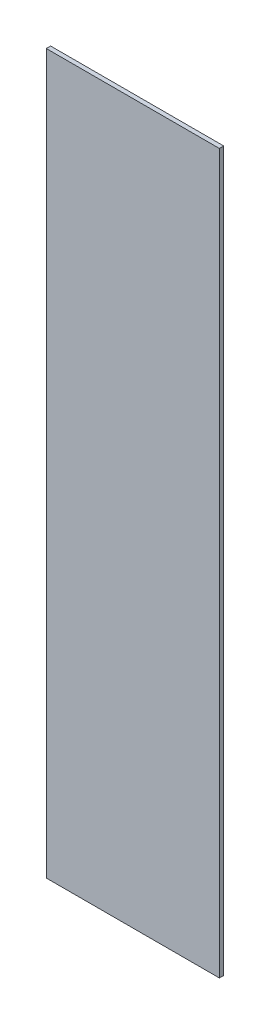
ISO-10303-21;
HEADER;
FILE_DESCRIPTION(('STEP AP214'),'2;1');
FILE_NAME('part.step','',(''),(''),'','','');
FILE_SCHEMA(('AUTOMOTIVE_DESIGN { 1 0 10303 214 1 1 1 1 }'));
ENDSEC;
DATA;
#1=APPLICATION_CONTEXT('core data for automotive mechanical design processes');
#2=APPLICATION_PROTOCOL_DEFINITION('international standard','automotive_design',2000,#1);
#3=PRODUCT_CONTEXT('',#1,'mechanical');
#4=PRODUCT('Part','Part','',(#3));
#5=PRODUCT_RELATED_PRODUCT_CATEGORY('part','',(#4));
#6=PRODUCT_DEFINITION_FORMATION('','',#4);
#7=PRODUCT_DEFINITION_CONTEXT('part definition',#1,'design');
#8=PRODUCT_DEFINITION('design','',#6,#7);
#9=PRODUCT_DEFINITION_SHAPE('','',#8);
#10=(LENGTH_UNIT() NAMED_UNIT(*) SI_UNIT(.MILLI.,.METRE.));
#11=(NAMED_UNIT(*) PLANE_ANGLE_UNIT() SI_UNIT($,.RADIAN.));
#12=(NAMED_UNIT(*) SI_UNIT($,.STERADIAN.) SOLID_ANGLE_UNIT());
#13=UNCERTAINTY_MEASURE_WITH_UNIT(LENGTH_MEASURE(1.E-05),#10,'distance_accuracy_value','');
#14=(GEOMETRIC_REPRESENTATION_CONTEXT(3) GLOBAL_UNCERTAINTY_ASSIGNED_CONTEXT((#13)) GLOBAL_UNIT_ASSIGNED_CONTEXT((#10,
#11,#12)) REPRESENTATION_CONTEXT('',''));
#15=CARTESIAN_POINT('',(0.,0.,0.));
#16=DIRECTION('',(0.,0.,1.));
#17=DIRECTION('',(1.,0.,0.));
#18=AXIS2_PLACEMENT_3D('',#15,#16,#17);
#19=CARTESIAN_POINT('',(10.,-41.5,0.5));
#20=DIRECTION('',(-1.,0.,0.));
#21=DIRECTION('',(0.,0.,1.));
#22=AXIS2_PLACEMENT_3D('',#19,#20,#21);
#23=PLANE('',#22);
#24=DIRECTION('',(0.,1.,0.));
#25=VECTOR('',#24,1.);
#26=CARTESIAN_POINT('',(10.,-41.5,0.));
#27=LINE('',#26,#25);
#28=CARTESIAN_POINT('',(10.,-41.5,0.));
#29=VERTEX_POINT('',#28);
#30=CARTESIAN_POINT('',(10.,41.5,0.));
#31=VERTEX_POINT('',#30);
#32=EDGE_CURVE('E96',#29,#31,#27,.T.);
#33=ORIENTED_EDGE('',*,*,#32,.T.);
#34=DIRECTION('',(0.,0.,-1.));
#35=VECTOR('',#34,1.);
#36=CARTESIAN_POINT('',(10.,41.5,0.5));
#37=LINE('',#36,#35);
#38=CARTESIAN_POINT('',(10.,41.5,0.5));
#39=VERTEX_POINT('',#38);
#40=EDGE_CURVE('E11',#39,#31,#37,.T.);
#41=ORIENTED_EDGE('',*,*,#40,.F.);
#42=DIRECTION('',(0.,1.,0.));
#43=VECTOR('',#42,1.);
#44=CARTESIAN_POINT('',(10.,-41.5,0.5));
#45=LINE('',#44,#43);
#46=CARTESIAN_POINT('',(10.,-41.5,0.5));
#47=VERTEX_POINT('',#46);
#48=EDGE_CURVE('E84',#47,#39,#45,.T.);
#49=ORIENTED_EDGE('',*,*,#48,.F.);
#50=DIRECTION('',(0.,0.,-1.));
#51=VECTOR('',#50,1.);
#52=CARTESIAN_POINT('',(10.,-41.5,0.5));
#53=LINE('',#52,#51);
#54=EDGE_CURVE('E92',#47,#29,#53,.T.);
#55=ORIENTED_EDGE('',*,*,#54,.T.);
#56=EDGE_LOOP('',(#33,#41,#49,#55));
#57=FACE_BOUND('',#56,.T.);
#58=ADVANCED_FACE('F33',(#57),#23,.F.);
#59=CARTESIAN_POINT('',(-10.,41.5,0.5));
#60=DIRECTION('',(0.,-1.,0.));
#61=DIRECTION('',(0.,0.,-1.));
#62=AXIS2_PLACEMENT_3D('',#59,#60,#61);
#63=PLANE('',#62);
#64=DIRECTION('',(-1.,0.,0.));
#65=VECTOR('',#64,1.);
#66=CARTESIAN_POINT('',(-10.,41.5,0.));
#67=LINE('',#66,#65);
#68=CARTESIAN_POINT('',(-10.,41.5,0.));
#69=VERTEX_POINT('',#68);
#70=EDGE_CURVE('E88',#31,#69,#67,.T.);
#71=ORIENTED_EDGE('',*,*,#70,.T.);
#72=DIRECTION('',(0.,0.,-1.));
#73=VECTOR('',#72,1.);
#74=CARTESIAN_POINT('',(-10.,41.5,0.5));
#75=LINE('',#74,#73);
#76=CARTESIAN_POINT('',(-10.,41.5,0.5));
#77=VERTEX_POINT('',#76);
#78=EDGE_CURVE('E41',#77,#69,#75,.T.);
#79=ORIENTED_EDGE('',*,*,#78,.F.);
#80=DIRECTION('',(-1.,0.,0.));
#81=VECTOR('',#80,1.);
#82=CARTESIAN_POINT('',(-10.,41.5,0.5));
#83=LINE('',#82,#81);
#84=EDGE_CURVE('E79',#39,#77,#83,.T.);
#85=ORIENTED_EDGE('',*,*,#84,.F.);
#86=ORIENTED_EDGE('',*,*,#40,.T.);
#87=EDGE_LOOP('',(#71,#79,#85,#86));
#88=FACE_BOUND('',#87,.T.);
#89=ADVANCED_FACE('F87',(#88),#63,.F.);
#90=CARTESIAN_POINT('',(-10.,-41.5,0.5));
#91=DIRECTION('',(1.,0.,0.));
#92=DIRECTION('',(0.,0.,-1.));
#93=AXIS2_PLACEMENT_3D('',#90,#91,#92);
#94=PLANE('',#93);
#95=DIRECTION('',(0.,-1.,0.));
#96=VECTOR('',#95,1.);
#97=CARTESIAN_POINT('',(-10.,-41.5,0.));
#98=LINE('',#97,#96);
#99=CARTESIAN_POINT('',(-10.,-41.5,0.));
#100=VERTEX_POINT('',#99);
#101=EDGE_CURVE('E66',#69,#100,#98,.T.);
#102=ORIENTED_EDGE('',*,*,#101,.T.);
#103=DIRECTION('',(0.,0.,-1.));
#104=VECTOR('',#103,1.);
#105=CARTESIAN_POINT('',(-10.,-41.5,0.5));
#106=LINE('',#105,#104);
#107=CARTESIAN_POINT('',(-10.,-41.5,0.5));
#108=VERTEX_POINT('',#107);
#109=EDGE_CURVE('E89',#108,#100,#106,.T.);
#110=ORIENTED_EDGE('',*,*,#109,.F.);
#111=DIRECTION('',(0.,-1.,0.));
#112=VECTOR('',#111,1.);
#113=CARTESIAN_POINT('',(-10.,-41.5,0.5));
#114=LINE('',#113,#112);
#115=EDGE_CURVE('E82',#77,#108,#114,.T.);
#116=ORIENTED_EDGE('',*,*,#115,.F.);
#117=ORIENTED_EDGE('',*,*,#78,.T.);
#118=EDGE_LOOP('',(#102,#110,#116,#117));
#119=FACE_BOUND('',#118,.T.);
#120=ADVANCED_FACE('F90',(#119),#94,.F.);
#121=CARTESIAN_POINT('',(-10.,-41.5,0.5));
#122=DIRECTION('',(0.,1.,0.));
#123=DIRECTION('',(0.,0.,1.));
#124=AXIS2_PLACEMENT_3D('',#121,#122,#123);
#125=PLANE('',#124);
#126=DIRECTION('',(1.,0.,0.));
#127=VECTOR('',#126,1.);
#128=CARTESIAN_POINT('',(-10.,-41.5,0.));
#129=LINE('',#128,#127);
#130=EDGE_CURVE('E72',#100,#29,#129,.T.);
#131=ORIENTED_EDGE('',*,*,#130,.T.);
#132=ORIENTED_EDGE('',*,*,#54,.F.);
#133=DIRECTION('',(1.,0.,0.));
#134=VECTOR('',#133,1.);
#135=CARTESIAN_POINT('',(-10.,-41.5,0.5));
#136=LINE('',#135,#134);
#137=EDGE_CURVE('E49',#108,#47,#136,.T.);
#138=ORIENTED_EDGE('',*,*,#137,.F.);
#139=ORIENTED_EDGE('',*,*,#109,.T.);
#140=EDGE_LOOP('',(#131,#132,#138,#139));
#141=FACE_BOUND('',#140,.T.);
#142=ADVANCED_FACE('F103',(#141),#125,.F.);
#143=CARTESIAN_POINT('',(0.,0.,0.5));
#144=DIRECTION('',(0.,0.,-1.));
#145=DIRECTION('',(-1.,0.,0.));
#146=AXIS2_PLACEMENT_3D('',#143,#144,#145);
#147=PLANE('',#146);
#148=ORIENTED_EDGE('',*,*,#48,.T.);
#149=ORIENTED_EDGE('',*,*,#84,.T.);
#150=ORIENTED_EDGE('',*,*,#115,.T.);
#151=ORIENTED_EDGE('',*,*,#137,.T.);
#152=EDGE_LOOP('',(#148,#149,#150,#151));
#153=FACE_BOUND('',#152,.T.);
#154=ADVANCED_FACE('F80',(#153),#147,.F.);
#155=CARTESIAN_POINT('',(0.,0.,0.));
#156=DIRECTION('',(0.,0.,-1.));
#157=DIRECTION('',(-1.,0.,0.));
#158=AXIS2_PLACEMENT_3D('',#155,#156,#157);
#159=PLANE('',#158);
#160=ORIENTED_EDGE('',*,*,#32,.F.);
#161=ORIENTED_EDGE('',*,*,#130,.F.);
#162=ORIENTED_EDGE('',*,*,#101,.F.);
#163=ORIENTED_EDGE('',*,*,#70,.F.);
#164=EDGE_LOOP('',(#160,#161,#162,#163));
#165=FACE_BOUND('',#164,.T.);
#166=ADVANCED_FACE('F106',(#165),#159,.T.);
#167=CLOSED_SHELL('',(#58,#89,#120,#142,#154,#166));
#168=MANIFOLD_SOLID_BREP('B2',#167);
#169=ADVANCED_BREP_SHAPE_REPRESENTATION('',(#18,#168),#14);
#170=SHAPE_DEFINITION_REPRESENTATION(#9,#169);
ENDSEC;
END-ISO-10303-21;
